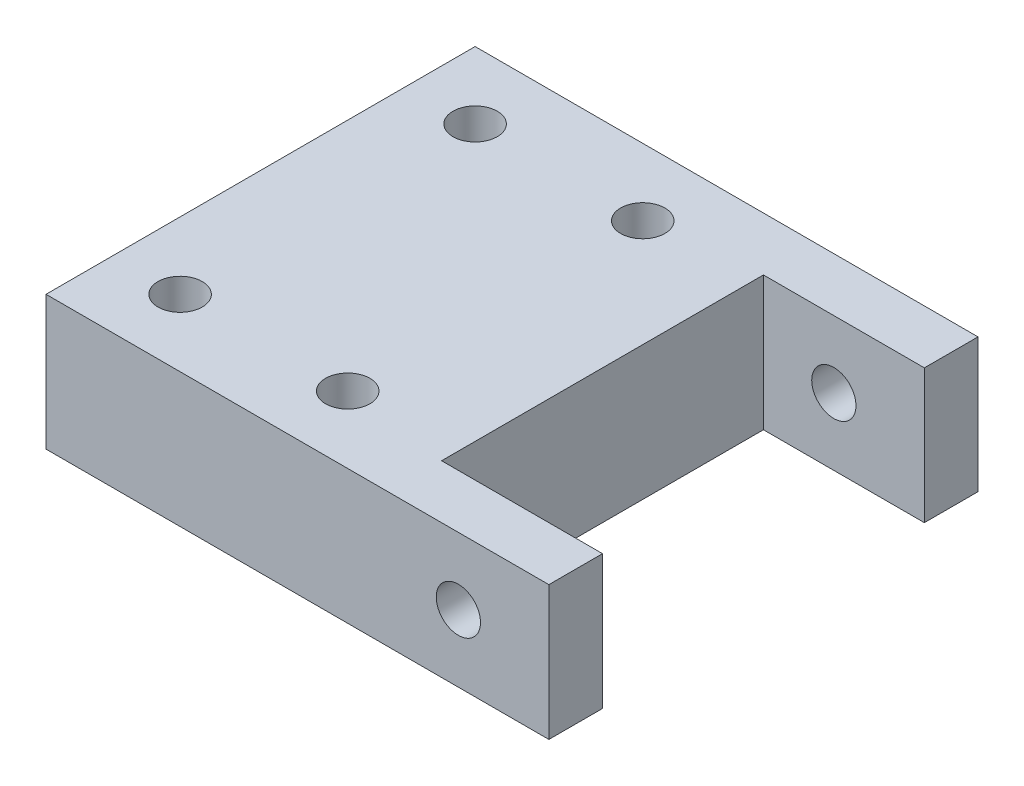
ISO-10303-21;
HEADER;
FILE_DESCRIPTION(('STEP AP214'),'2;1');
FILE_NAME('part.step','',(''),(''),'','','');
FILE_SCHEMA(('AUTOMOTIVE_DESIGN { 1 0 10303 214 1 1 1 1 }'));
ENDSEC;
DATA;
#1=APPLICATION_CONTEXT('core data for automotive mechanical design processes');
#2=APPLICATION_PROTOCOL_DEFINITION('international standard','automotive_design',2000,#1);
#3=PRODUCT_CONTEXT('',#1,'mechanical');
#4=PRODUCT('Part','Part','',(#3));
#5=PRODUCT_RELATED_PRODUCT_CATEGORY('part','',(#4));
#6=PRODUCT_DEFINITION_FORMATION('','',#4);
#7=PRODUCT_DEFINITION_CONTEXT('part definition',#1,'design');
#8=PRODUCT_DEFINITION('design','',#6,#7);
#9=PRODUCT_DEFINITION_SHAPE('','',#8);
#10=(LENGTH_UNIT() NAMED_UNIT(*) SI_UNIT(.MILLI.,.METRE.));
#11=(NAMED_UNIT(*) PLANE_ANGLE_UNIT() SI_UNIT($,.RADIAN.));
#12=(NAMED_UNIT(*) SI_UNIT($,.STERADIAN.) SOLID_ANGLE_UNIT());
#13=UNCERTAINTY_MEASURE_WITH_UNIT(LENGTH_MEASURE(1.E-05),#10,'distance_accuracy_value','');
#14=(GEOMETRIC_REPRESENTATION_CONTEXT(3) GLOBAL_UNCERTAINTY_ASSIGNED_CONTEXT((#13)) GLOBAL_UNIT_ASSIGNED_CONTEXT((#10,
#11,#12)) REPRESENTATION_CONTEXT('',''));
#15=CARTESIAN_POINT('',(0.,0.,0.));
#16=DIRECTION('',(0.,0.,1.));
#17=DIRECTION('',(1.,0.,0.));
#18=AXIS2_PLACEMENT_3D('',#15,#16,#17);
#19=CARTESIAN_POINT('',(36.,10.,-23.5));
#20=DIRECTION('',(-1.,0.,0.));
#21=DIRECTION('',(0.,0.,1.));
#22=AXIS2_PLACEMENT_3D('',#19,#20,#21);
#23=PLANE('',#22);
#24=DIRECTION('',(0.,0.,-1.));
#25=VECTOR('',#24,1.);
#26=CARTESIAN_POINT('',(36.,10.,-23.5));
#27=LINE('',#26,#25);
#28=CARTESIAN_POINT('',(36.,10.,-19.5));
#29=VERTEX_POINT('',#28);
#30=CARTESIAN_POINT('',(36.,10.,-23.5));
#31=VERTEX_POINT('',#30);
#32=EDGE_CURVE('E58',#29,#31,#27,.T.);
#33=ORIENTED_EDGE('',*,*,#32,.F.);
#34=DIRECTION('',(0.,1.,0.));
#35=VECTOR('',#34,1.);
#36=CARTESIAN_POINT('',(36.,0.,-19.5));
#37=LINE('',#36,#35);
#38=CARTESIAN_POINT('',(36.,0.,-19.5));
#39=VERTEX_POINT('',#38);
#40=EDGE_CURVE('E123',#39,#29,#37,.T.);
#41=ORIENTED_EDGE('',*,*,#40,.F.);
#42=DIRECTION('',(0.,0.,-1.));
#43=VECTOR('',#42,1.);
#44=CARTESIAN_POINT('',(36.,0.,-23.5));
#45=LINE('',#44,#43);
#46=CARTESIAN_POINT('',(36.,0.,-23.5));
#47=VERTEX_POINT('',#46);
#48=EDGE_CURVE('E80',#39,#47,#45,.T.);
#49=ORIENTED_EDGE('',*,*,#48,.T.);
#50=DIRECTION('',(0.,-1.,0.));
#51=VECTOR('',#50,1.);
#52=CARTESIAN_POINT('',(36.,10.,-23.5));
#53=LINE('',#52,#51);
#54=EDGE_CURVE('E173',#31,#47,#53,.T.);
#55=ORIENTED_EDGE('',*,*,#54,.F.);
#56=EDGE_LOOP('',(#33,#41,#49,#55));
#57=FACE_BOUND('',#56,.T.);
#58=ADVANCED_FACE('F32',(#57),#23,.F.);
#59=CARTESIAN_POINT('',(-1.5,10.,-23.5));
#60=DIRECTION('',(0.,0.,1.));
#61=DIRECTION('',(1.,0.,0.));
#62=AXIS2_PLACEMENT_3D('',#59,#60,#61);
#63=PLANE('',#62);
#64=CARTESIAN_POINT('',(29.25,5.,-23.5));
#65=DIRECTION('',(0.,0.,-1.));
#66=DIRECTION('',(-1.,0.,0.));
#67=AXIS2_PLACEMENT_3D('',#64,#65,#66);
#68=CIRCLE('',#67,1.65);
#69=CARTESIAN_POINT('',(27.6,5.,-23.5));
#70=VERTEX_POINT('',#69);
#71=EDGE_CURVE('E135',#70,#70,#68,.T.);
#72=ORIENTED_EDGE('',*,*,#71,.F.);
#73=EDGE_LOOP('',(#72));
#74=FACE_BOUND('',#73,.T.);
#75=DIRECTION('',(-1.,0.,0.));
#76=VECTOR('',#75,1.);
#77=CARTESIAN_POINT('',(-1.5,0.,-23.5));
#78=LINE('',#77,#76);
#79=CARTESIAN_POINT('',(-1.5,0.,-23.5));
#80=VERTEX_POINT('',#79);
#81=EDGE_CURVE('E163',#47,#80,#78,.T.);
#82=ORIENTED_EDGE('',*,*,#81,.T.);
#83=DIRECTION('',(0.,-1.,0.));
#84=VECTOR('',#83,1.);
#85=CARTESIAN_POINT('',(-1.5,10.,-23.5));
#86=LINE('',#85,#84);
#87=CARTESIAN_POINT('',(-1.5,10.,-23.5));
#88=VERTEX_POINT('',#87);
#89=EDGE_CURVE('E11',#88,#80,#86,.T.);
#90=ORIENTED_EDGE('',*,*,#89,.F.);
#91=DIRECTION('',(-1.,0.,0.));
#92=VECTOR('',#91,1.);
#93=CARTESIAN_POINT('',(-1.5,10.,-23.5));
#94=LINE('',#93,#92);
#95=EDGE_CURVE('E166',#31,#88,#94,.T.);
#96=ORIENTED_EDGE('',*,*,#95,.F.);
#97=ORIENTED_EDGE('',*,*,#54,.T.);
#98=EDGE_LOOP('',(#82,#90,#96,#97));
#99=FACE_BOUND('',#98,.T.);
#100=ADVANCED_FACE('F34',(#74,#99),#63,.F.);
#101=CARTESIAN_POINT('',(-1.5,10.,8.5));
#102=DIRECTION('',(1.,0.,0.));
#103=DIRECTION('',(0.,0.,-1.));
#104=AXIS2_PLACEMENT_3D('',#101,#102,#103);
#105=PLANE('',#104);
#106=DIRECTION('',(0.,0.,1.));
#107=VECTOR('',#106,1.);
#108=CARTESIAN_POINT('',(-1.5,0.,8.5));
#109=LINE('',#108,#107);
#110=CARTESIAN_POINT('',(-1.5,0.,8.5));
#111=VERTEX_POINT('',#110);
#112=EDGE_CURVE('E176',#80,#111,#109,.T.);
#113=ORIENTED_EDGE('',*,*,#112,.T.);
#114=DIRECTION('',(0.,-1.,0.));
#115=VECTOR('',#114,1.);
#116=CARTESIAN_POINT('',(-1.5,10.,8.5));
#117=LINE('',#116,#115);
#118=CARTESIAN_POINT('',(-1.5,10.,8.5));
#119=VERTEX_POINT('',#118);
#120=EDGE_CURVE('E41',#119,#111,#117,.T.);
#121=ORIENTED_EDGE('',*,*,#120,.F.);
#122=DIRECTION('',(0.,0.,1.));
#123=VECTOR('',#122,1.);
#124=CARTESIAN_POINT('',(-1.5,10.,8.5));
#125=LINE('',#124,#123);
#126=EDGE_CURVE('E87',#88,#119,#125,.T.);
#127=ORIENTED_EDGE('',*,*,#126,.F.);
#128=ORIENTED_EDGE('',*,*,#89,.T.);
#129=EDGE_LOOP('',(#113,#121,#127,#128));
#130=FACE_BOUND('',#129,.T.);
#131=ADVANCED_FACE('F216',(#130),#105,.F.);
#132=CARTESIAN_POINT('',(-1.5,10.,8.5));
#133=DIRECTION('',(0.,0.,-1.));
#134=DIRECTION('',(-1.,0.,0.));
#135=AXIS2_PLACEMENT_3D('',#132,#133,#134);
#136=PLANE('',#135);
#137=CARTESIAN_POINT('',(29.25,5.,8.5));
#138=DIRECTION('',(0.,0.,1.));
#139=DIRECTION('',(1.,0.,0.));
#140=AXIS2_PLACEMENT_3D('',#137,#138,#139);
#141=CIRCLE('',#140,1.65);
#142=CARTESIAN_POINT('',(30.9,5.,8.5));
#143=VERTEX_POINT('',#142);
#144=EDGE_CURVE('E138',#143,#143,#141,.T.);
#145=ORIENTED_EDGE('',*,*,#144,.F.);
#146=EDGE_LOOP('',(#145));
#147=FACE_BOUND('',#146,.T.);
#148=DIRECTION('',(1.,0.,0.));
#149=VECTOR('',#148,1.);
#150=CARTESIAN_POINT('',(-1.5,0.,8.5));
#151=LINE('',#150,#149);
#152=CARTESIAN_POINT('',(36.,0.,8.5));
#153=VERTEX_POINT('',#152);
#154=EDGE_CURVE('E178',#111,#153,#151,.T.);
#155=ORIENTED_EDGE('',*,*,#154,.T.);
#156=DIRECTION('',(0.,-1.,0.));
#157=VECTOR('',#156,1.);
#158=CARTESIAN_POINT('',(36.,10.,8.5));
#159=LINE('',#158,#157);
#160=CARTESIAN_POINT('',(36.,10.,8.5));
#161=VERTEX_POINT('',#160);
#162=EDGE_CURVE('E183',#161,#153,#159,.T.);
#163=ORIENTED_EDGE('',*,*,#162,.F.);
#164=DIRECTION('',(1.,0.,0.));
#165=VECTOR('',#164,1.);
#166=CARTESIAN_POINT('',(-1.5,10.,8.5));
#167=LINE('',#166,#165);
#168=EDGE_CURVE('E170',#119,#161,#167,.T.);
#169=ORIENTED_EDGE('',*,*,#168,.F.);
#170=ORIENTED_EDGE('',*,*,#120,.T.);
#171=EDGE_LOOP('',(#155,#163,#169,#170));
#172=FACE_BOUND('',#171,.T.);
#173=ADVANCED_FACE('F221',(#147,#172),#136,.F.);
#174=CARTESIAN_POINT('',(36.,0.,4.5));
#175=VERTEX_POINT('',#174);
#176=EDGE_CURVE('E168',#153,#175,#45,.T.);
#177=ORIENTED_EDGE('',*,*,#176,.T.);
#178=DIRECTION('',(0.,-1.,0.));
#179=VECTOR('',#178,1.);
#180=CARTESIAN_POINT('',(36.,10.,4.5));
#181=LINE('',#180,#179);
#182=CARTESIAN_POINT('',(36.,10.,4.5));
#183=VERTEX_POINT('',#182);
#184=EDGE_CURVE('E196',#183,#175,#181,.T.);
#185=ORIENTED_EDGE('',*,*,#184,.F.);
#186=EDGE_CURVE('E128',#161,#183,#27,.T.);
#187=ORIENTED_EDGE('',*,*,#186,.F.);
#188=ORIENTED_EDGE('',*,*,#162,.T.);
#189=EDGE_LOOP('',(#177,#185,#187,#188));
#190=FACE_BOUND('',#189,.T.);
#191=ADVANCED_FACE('F212',(#190),#23,.F.);
#192=CARTESIAN_POINT('',(0.,10.,0.));
#193=DIRECTION('',(0.,-1.,0.));
#194=DIRECTION('',(0.,0.,-1.));
#195=AXIS2_PLACEMENT_3D('',#192,#193,#194);
#196=PLANE('',#195);
#197=CARTESIAN_POINT('',(16.,10.,-18.5));
#198=DIRECTION('',(0.,-1.,0.));
#199=DIRECTION('',(0.,0.,-1.));
#200=AXIS2_PLACEMENT_3D('',#197,#198,#199);
#201=CIRCLE('',#200,1.65);
#202=CARTESIAN_POINT('',(16.,10.,-20.15));
#203=VERTEX_POINT('',#202);
#204=EDGE_CURVE('E152',#203,#203,#201,.T.);
#205=ORIENTED_EDGE('',*,*,#204,.T.);
#206=EDGE_LOOP('',(#205));
#207=FACE_BOUND('',#206,.T.);
#208=CARTESIAN_POINT('',(3.5,10.,3.5));
#209=DIRECTION('',(0.,-1.,0.));
#210=DIRECTION('',(0.,0.,-1.));
#211=AXIS2_PLACEMENT_3D('',#208,#209,#210);
#212=CIRCLE('',#211,1.65);
#213=CARTESIAN_POINT('',(3.5,10.,1.85));
#214=VERTEX_POINT('',#213);
#215=EDGE_CURVE('E145',#214,#214,#212,.T.);
#216=ORIENTED_EDGE('',*,*,#215,.T.);
#217=EDGE_LOOP('',(#216));
#218=FACE_BOUND('',#217,.T.);
#219=CARTESIAN_POINT('',(16.,10.,3.5));
#220=DIRECTION('',(0.,-1.,0.));
#221=DIRECTION('',(0.,0.,-1.));
#222=AXIS2_PLACEMENT_3D('',#219,#220,#221);
#223=CIRCLE('',#222,1.65);
#224=CARTESIAN_POINT('',(16.,10.,1.85));
#225=VERTEX_POINT('',#224);
#226=EDGE_CURVE('E141',#225,#225,#223,.T.);
#227=ORIENTED_EDGE('',*,*,#226,.T.);
#228=EDGE_LOOP('',(#227));
#229=FACE_BOUND('',#228,.T.);
#230=CARTESIAN_POINT('',(3.5,10.,-18.5));
#231=DIRECTION('',(0.,-1.,0.));
#232=DIRECTION('',(0.,0.,-1.));
#233=AXIS2_PLACEMENT_3D('',#230,#231,#232);
#234=CIRCLE('',#233,1.65);
#235=CARTESIAN_POINT('',(3.5,10.,-20.15));
#236=VERTEX_POINT('',#235);
#237=EDGE_CURVE('E160',#236,#236,#234,.T.);
#238=ORIENTED_EDGE('',*,*,#237,.T.);
#239=EDGE_LOOP('',(#238));
#240=FACE_BOUND('',#239,.T.);
#241=DIRECTION('',(0.,0.,1.));
#242=VECTOR('',#241,1.);
#243=CARTESIAN_POINT('',(24.,10.,-19.5));
#244=LINE('',#243,#242);
#245=CARTESIAN_POINT('',(24.,10.,-19.5));
#246=VERTEX_POINT('',#245);
#247=CARTESIAN_POINT('',(24.,10.,4.5));
#248=VERTEX_POINT('',#247);
#249=EDGE_CURVE('E116',#246,#248,#244,.T.);
#250=ORIENTED_EDGE('',*,*,#249,.F.);
#251=DIRECTION('',(1.,0.,0.));
#252=VECTOR('',#251,1.);
#253=CARTESIAN_POINT('',(24.,10.,-19.5));
#254=LINE('',#253,#252);
#255=EDGE_CURVE('E189',#246,#29,#254,.T.);
#256=ORIENTED_EDGE('',*,*,#255,.T.);
#257=ORIENTED_EDGE('',*,*,#32,.T.);
#258=ORIENTED_EDGE('',*,*,#95,.T.);
#259=ORIENTED_EDGE('',*,*,#126,.T.);
#260=ORIENTED_EDGE('',*,*,#168,.T.);
#261=ORIENTED_EDGE('',*,*,#186,.T.);
#262=DIRECTION('',(1.,0.,0.));
#263=VECTOR('',#262,1.);
#264=CARTESIAN_POINT('',(24.,10.,4.5));
#265=LINE('',#264,#263);
#266=EDGE_CURVE('E110',#248,#183,#265,.T.);
#267=ORIENTED_EDGE('',*,*,#266,.F.);
#268=EDGE_LOOP('',(#250,#256,#257,#258,#259,#260,#261,#267));
#269=FACE_BOUND('',#268,.T.);
#270=ADVANCED_FACE('F126',(#207,#218,#229,#240,#269),#196,.F.);
#271=CARTESIAN_POINT('',(0.,0.,0.));
#272=DIRECTION('',(0.,-1.,0.));
#273=DIRECTION('',(0.,0.,-1.));
#274=AXIS2_PLACEMENT_3D('',#271,#272,#273);
#275=PLANE('',#274);
#276=DIRECTION('',(1.,0.,0.));
#277=VECTOR('',#276,1.);
#278=CARTESIAN_POINT('',(24.,0.,-19.5));
#279=LINE('',#278,#277);
#280=CARTESIAN_POINT('',(24.,0.,-19.5));
#281=VERTEX_POINT('',#280);
#282=EDGE_CURVE('E130',#281,#39,#279,.T.);
#283=ORIENTED_EDGE('',*,*,#282,.F.);
#284=DIRECTION('',(0.,0.,-1.));
#285=VECTOR('',#284,1.);
#286=CARTESIAN_POINT('',(24.,0.,4.5));
#287=LINE('',#286,#285);
#288=CARTESIAN_POINT('',(24.,0.,4.5));
#289=VERTEX_POINT('',#288);
#290=EDGE_CURVE('E115',#289,#281,#287,.T.);
#291=ORIENTED_EDGE('',*,*,#290,.F.);
#292=DIRECTION('',(1.,0.,0.));
#293=VECTOR('',#292,1.);
#294=CARTESIAN_POINT('',(24.,0.,4.5));
#295=LINE('',#294,#293);
#296=EDGE_CURVE('E113',#289,#175,#295,.T.);
#297=ORIENTED_EDGE('',*,*,#296,.T.);
#298=ORIENTED_EDGE('',*,*,#176,.F.);
#299=ORIENTED_EDGE('',*,*,#154,.F.);
#300=ORIENTED_EDGE('',*,*,#112,.F.);
#301=ORIENTED_EDGE('',*,*,#81,.F.);
#302=ORIENTED_EDGE('',*,*,#48,.F.);
#303=EDGE_LOOP('',(#283,#291,#297,#298,#299,#300,#301,#302));
#304=FACE_BOUND('',#303,.T.);
#305=CARTESIAN_POINT('',(16.,0.,-18.5));
#306=DIRECTION('',(0.,-1.,0.));
#307=DIRECTION('',(0.,0.,-1.));
#308=AXIS2_PLACEMENT_3D('',#305,#306,#307);
#309=CIRCLE('',#308,1.65);
#310=CARTESIAN_POINT('',(16.,0.,-20.15));
#311=VERTEX_POINT('',#310);
#312=EDGE_CURVE('E148',#311,#311,#309,.T.);
#313=ORIENTED_EDGE('',*,*,#312,.F.);
#314=EDGE_LOOP('',(#313));
#315=FACE_BOUND('',#314,.T.);
#316=CARTESIAN_POINT('',(3.5,0.,3.5));
#317=DIRECTION('',(0.,-1.,0.));
#318=DIRECTION('',(0.,0.,-1.));
#319=AXIS2_PLACEMENT_3D('',#316,#317,#318);
#320=CIRCLE('',#319,1.65);
#321=CARTESIAN_POINT('',(3.5,0.,1.85));
#322=VERTEX_POINT('',#321);
#323=EDGE_CURVE('E155',#322,#322,#320,.T.);
#324=ORIENTED_EDGE('',*,*,#323,.F.);
#325=EDGE_LOOP('',(#324));
#326=FACE_BOUND('',#325,.T.);
#327=CARTESIAN_POINT('',(16.,0.,3.5));
#328=DIRECTION('',(0.,-1.,0.));
#329=DIRECTION('',(0.,0.,-1.));
#330=AXIS2_PLACEMENT_3D('',#327,#328,#329);
#331=CIRCLE('',#330,1.65);
#332=CARTESIAN_POINT('',(16.,0.,1.85));
#333=VERTEX_POINT('',#332);
#334=EDGE_CURVE('E142',#333,#333,#331,.T.);
#335=ORIENTED_EDGE('',*,*,#334,.F.);
#336=EDGE_LOOP('',(#335));
#337=FACE_BOUND('',#336,.T.);
#338=CARTESIAN_POINT('',(3.5,0.,-18.5));
#339=DIRECTION('',(0.,-1.,0.));
#340=DIRECTION('',(0.,0.,-1.));
#341=AXIS2_PLACEMENT_3D('',#338,#339,#340);
#342=CIRCLE('',#341,1.65);
#343=CARTESIAN_POINT('',(3.5,0.,-20.15));
#344=VERTEX_POINT('',#343);
#345=EDGE_CURVE('E151',#344,#344,#342,.T.);
#346=ORIENTED_EDGE('',*,*,#345,.F.);
#347=EDGE_LOOP('',(#346));
#348=FACE_BOUND('',#347,.T.);
#349=ADVANCED_FACE('F203',(#304,#315,#326,#337,#348),#275,.T.);
#350=CARTESIAN_POINT('',(3.5,10.,-18.5));
#351=DIRECTION('',(0.,-1.,0.));
#352=DIRECTION('',(0.,0.,-1.));
#353=AXIS2_PLACEMENT_3D('',#350,#351,#352);
#354=CYLINDRICAL_SURFACE('',#353,1.65);
#355=ORIENTED_EDGE('',*,*,#237,.F.);
#356=EDGE_LOOP('',(#355));
#357=FACE_BOUND('',#356,.T.);
#358=ORIENTED_EDGE('',*,*,#345,.T.);
#359=EDGE_LOOP('',(#358));
#360=FACE_BOUND('',#359,.T.);
#361=ADVANCED_FACE('F279',(#357,#360),#354,.F.);
#362=CARTESIAN_POINT('',(16.,10.,3.5));
#363=DIRECTION('',(0.,-1.,0.));
#364=DIRECTION('',(0.,0.,-1.));
#365=AXIS2_PLACEMENT_3D('',#362,#363,#364);
#366=CYLINDRICAL_SURFACE('',#365,1.65);
#367=ORIENTED_EDGE('',*,*,#226,.F.);
#368=EDGE_LOOP('',(#367));
#369=FACE_BOUND('',#368,.T.);
#370=ORIENTED_EDGE('',*,*,#334,.T.);
#371=EDGE_LOOP('',(#370));
#372=FACE_BOUND('',#371,.T.);
#373=ADVANCED_FACE('F326',(#369,#372),#366,.F.);
#374=CARTESIAN_POINT('',(3.5,10.,3.5));
#375=DIRECTION('',(0.,-1.,0.));
#376=DIRECTION('',(0.,0.,-1.));
#377=AXIS2_PLACEMENT_3D('',#374,#375,#376);
#378=CYLINDRICAL_SURFACE('',#377,1.65);
#379=ORIENTED_EDGE('',*,*,#215,.F.);
#380=EDGE_LOOP('',(#379));
#381=FACE_BOUND('',#380,.T.);
#382=ORIENTED_EDGE('',*,*,#323,.T.);
#383=EDGE_LOOP('',(#382));
#384=FACE_BOUND('',#383,.T.);
#385=ADVANCED_FACE('F329',(#381,#384),#378,.F.);
#386=CARTESIAN_POINT('',(16.,10.,-18.5));
#387=DIRECTION('',(0.,-1.,0.));
#388=DIRECTION('',(0.,0.,-1.));
#389=AXIS2_PLACEMENT_3D('',#386,#387,#388);
#390=CYLINDRICAL_SURFACE('',#389,1.65);
#391=ORIENTED_EDGE('',*,*,#204,.F.);
#392=EDGE_LOOP('',(#391));
#393=FACE_BOUND('',#392,.T.);
#394=ORIENTED_EDGE('',*,*,#312,.T.);
#395=EDGE_LOOP('',(#394));
#396=FACE_BOUND('',#395,.T.);
#397=ADVANCED_FACE('F250',(#393,#396),#390,.F.);
#398=CARTESIAN_POINT('',(29.25,5.,2.5));
#399=DIRECTION('',(0.,0.,1.));
#400=DIRECTION('',(1.,0.,0.));
#401=AXIS2_PLACEMENT_3D('',#398,#399,#400);
#402=CYLINDRICAL_SURFACE('',#401,1.65);
#403=CARTESIAN_POINT('',(29.25,5.,4.5));
#404=DIRECTION('',(0.,0.,1.));
#405=DIRECTION('',(0.,-1.,0.));
#406=AXIS2_PLACEMENT_3D('',#403,#404,#405);
#407=CIRCLE('',#406,1.65);
#408=CARTESIAN_POINT('',(29.25,3.35,4.5));
#409=VERTEX_POINT('',#408);
#410=EDGE_CURVE('E36',#409,#409,#407,.F.);
#411=ORIENTED_EDGE('',*,*,#410,.T.);
#412=EDGE_LOOP('',(#411));
#413=FACE_BOUND('',#412,.T.);
#414=ORIENTED_EDGE('',*,*,#144,.T.);
#415=EDGE_LOOP('',(#414));
#416=FACE_BOUND('',#415,.T.);
#417=ADVANCED_FACE('F285',(#413,#416),#402,.F.);
#418=CARTESIAN_POINT('',(29.25,5.,-17.5));
#419=DIRECTION('',(0.,0.,-1.));
#420=DIRECTION('',(-1.,0.,0.));
#421=AXIS2_PLACEMENT_3D('',#418,#419,#420);
#422=CYLINDRICAL_SURFACE('',#421,1.65);
#423=CARTESIAN_POINT('',(29.25,5.,-19.5));
#424=DIRECTION('',(0.,0.,-1.));
#425=DIRECTION('',(0.,1.,0.));
#426=AXIS2_PLACEMENT_3D('',#423,#424,#425);
#427=CIRCLE('',#426,1.65);
#428=CARTESIAN_POINT('',(29.25,6.65,-19.5));
#429=VERTEX_POINT('',#428);
#430=EDGE_CURVE('E187',#429,#429,#427,.F.);
#431=ORIENTED_EDGE('',*,*,#430,.T.);
#432=EDGE_LOOP('',(#431));
#433=FACE_BOUND('',#432,.T.);
#434=ORIENTED_EDGE('',*,*,#71,.T.);
#435=EDGE_LOOP('',(#434));
#436=FACE_BOUND('',#435,.T.);
#437=ADVANCED_FACE('F290',(#433,#436),#422,.F.);
#438=CARTESIAN_POINT('',(24.,10.,4.5));
#439=DIRECTION('',(0.,0.,1.));
#440=DIRECTION('',(0.,-1.,0.));
#441=AXIS2_PLACEMENT_3D('',#438,#439,#440);
#442=PLANE('',#441);
#443=ORIENTED_EDGE('',*,*,#184,.T.);
#444=ORIENTED_EDGE('',*,*,#296,.F.);
#445=DIRECTION('',(0.,-1.,0.));
#446=VECTOR('',#445,1.);
#447=CARTESIAN_POINT('',(24.,10.,4.5));
#448=LINE('',#447,#446);
#449=EDGE_CURVE('E49',#248,#289,#448,.T.);
#450=ORIENTED_EDGE('',*,*,#449,.F.);
#451=ORIENTED_EDGE('',*,*,#266,.T.);
#452=EDGE_LOOP('',(#443,#444,#450,#451));
#453=FACE_BOUND('',#452,.T.);
#454=ORIENTED_EDGE('',*,*,#410,.F.);
#455=EDGE_LOOP('',(#454));
#456=FACE_BOUND('',#455,.T.);
#457=ADVANCED_FACE('F107',(#453,#456),#442,.F.);
#458=CARTESIAN_POINT('',(24.,0.,-19.5));
#459=DIRECTION('',(0.,0.,-1.));
#460=DIRECTION('',(0.,1.,0.));
#461=AXIS2_PLACEMENT_3D('',#458,#459,#460);
#462=PLANE('',#461);
#463=ORIENTED_EDGE('',*,*,#40,.T.);
#464=ORIENTED_EDGE('',*,*,#255,.F.);
#465=DIRECTION('',(0.,1.,0.));
#466=VECTOR('',#465,1.);
#467=CARTESIAN_POINT('',(24.,0.,-19.5));
#468=LINE('',#467,#466);
#469=EDGE_CURVE('E122',#281,#246,#468,.T.);
#470=ORIENTED_EDGE('',*,*,#469,.F.);
#471=ORIENTED_EDGE('',*,*,#282,.T.);
#472=EDGE_LOOP('',(#463,#464,#470,#471));
#473=FACE_BOUND('',#472,.T.);
#474=ORIENTED_EDGE('',*,*,#430,.F.);
#475=EDGE_LOOP('',(#474));
#476=FACE_BOUND('',#475,.T.);
#477=ADVANCED_FACE('F201',(#473,#476),#462,.F.);
#478=CARTESIAN_POINT('',(24.,0.,0.));
#479=DIRECTION('',(1.,0.,0.));
#480=DIRECTION('',(0.,0.,-1.));
#481=AXIS2_PLACEMENT_3D('',#478,#479,#480);
#482=PLANE('',#481);
#483=ORIENTED_EDGE('',*,*,#249,.T.);
#484=ORIENTED_EDGE('',*,*,#449,.T.);
#485=ORIENTED_EDGE('',*,*,#290,.T.);
#486=ORIENTED_EDGE('',*,*,#469,.T.);
#487=EDGE_LOOP('',(#483,#484,#485,#486));
#488=FACE_BOUND('',#487,.T.);
#489=ADVANCED_FACE('F120',(#488),#482,.T.);
#490=CLOSED_SHELL('',(#58,#100,#131,#173,#191,#270,#349,#361,#373,#385,#397,#417,#437,#457,#477,#489));
#491=MANIFOLD_SOLID_BREP('B2',#490);
#492=ADVANCED_BREP_SHAPE_REPRESENTATION('',(#18,#491),#14);
#493=SHAPE_DEFINITION_REPRESENTATION(#9,#492);
ENDSEC;
END-ISO-10303-21;
